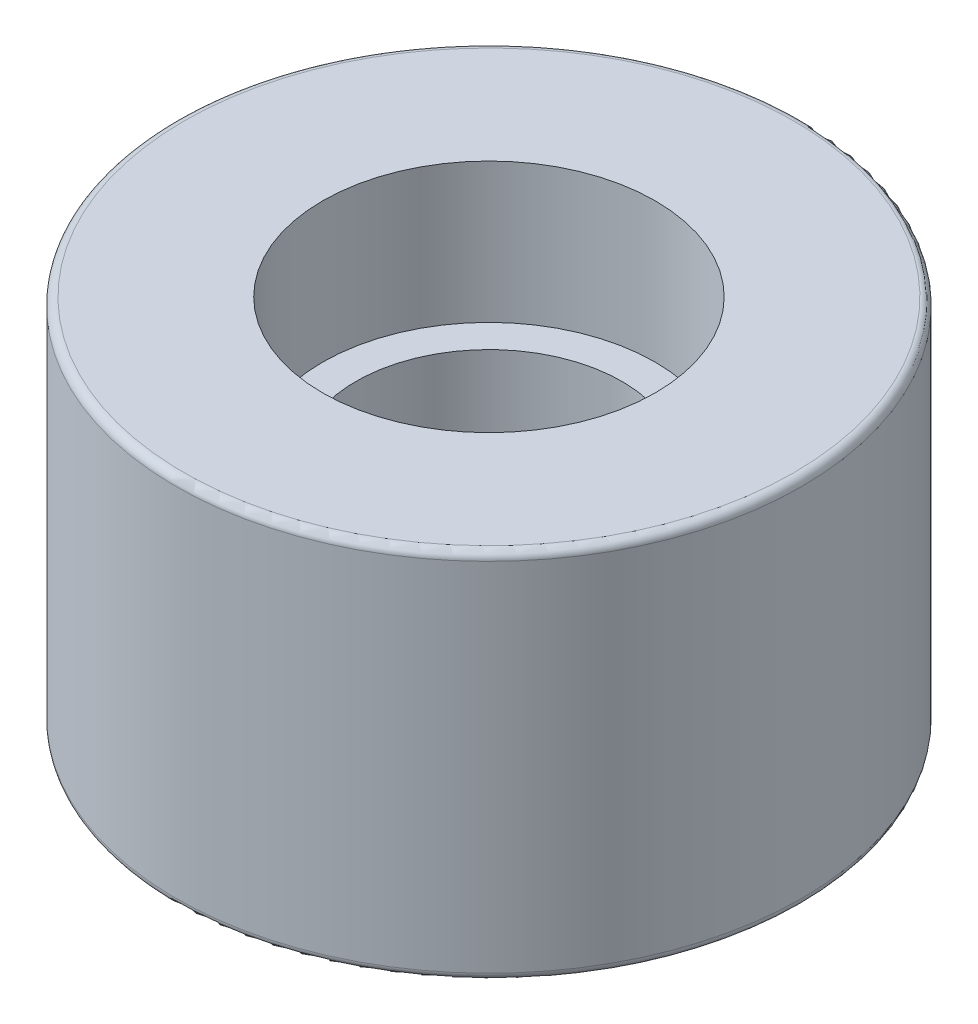
ISO-10303-21;
HEADER;
FILE_DESCRIPTION(('STEP AP214'),'2;1');
FILE_NAME('part.step','',(''),(''),'','','');
FILE_SCHEMA(('AUTOMOTIVE_DESIGN { 1 0 10303 214 1 1 1 1 }'));
ENDSEC;
DATA;
#1=APPLICATION_CONTEXT('core data for automotive mechanical design processes');
#2=APPLICATION_PROTOCOL_DEFINITION('international standard','automotive_design',2000,#1);
#3=PRODUCT_CONTEXT('',#1,'mechanical');
#4=PRODUCT('Part','Part','',(#3));
#5=PRODUCT_RELATED_PRODUCT_CATEGORY('part','',(#4));
#6=PRODUCT_DEFINITION_FORMATION('','',#4);
#7=PRODUCT_DEFINITION_CONTEXT('part definition',#1,'design');
#8=PRODUCT_DEFINITION('design','',#6,#7);
#9=PRODUCT_DEFINITION_SHAPE('','',#8);
#10=(LENGTH_UNIT() NAMED_UNIT(*) SI_UNIT(.MILLI.,.METRE.));
#11=(NAMED_UNIT(*) PLANE_ANGLE_UNIT() SI_UNIT($,.RADIAN.));
#12=(NAMED_UNIT(*) SI_UNIT($,.STERADIAN.) SOLID_ANGLE_UNIT());
#13=UNCERTAINTY_MEASURE_WITH_UNIT(LENGTH_MEASURE(1.E-05),#10,'distance_accuracy_value','');
#14=(GEOMETRIC_REPRESENTATION_CONTEXT(3) GLOBAL_UNCERTAINTY_ASSIGNED_CONTEXT((#13)) GLOBAL_UNIT_ASSIGNED_CONTEXT((#10,
#11,#12)) REPRESENTATION_CONTEXT('',''));
#15=CARTESIAN_POINT('',(0.,0.,0.));
#16=DIRECTION('',(0.,0.,1.));
#17=DIRECTION('',(1.,0.,0.));
#18=AXIS2_PLACEMENT_3D('',#15,#16,#17);
#19=CARTESIAN_POINT('',(0.,0.,0.));
#20=DIRECTION('',(0.,-1.,0.));
#21=DIRECTION('',(1.,0.,0.));
#22=AXIS2_PLACEMENT_3D('',#19,#20,#21);
#23=CYLINDRICAL_SURFACE('',#22,12.5);
#24=CARTESIAN_POINT('',(0.,28.,0.));
#25=DIRECTION('',(0.,-1.,0.));
#26=DIRECTION('',(1.,0.,0.));
#27=AXIS2_PLACEMENT_3D('',#24,#25,#26);
#28=CIRCLE('',#27,12.5);
#29=CARTESIAN_POINT('',(12.5,28.,0.));
#30=VERTEX_POINT('',#29);
#31=EDGE_CURVE('E10',#30,#30,#28,.T.);
#32=ORIENTED_EDGE('',*,*,#31,.F.);
#33=EDGE_LOOP('',(#32));
#34=FACE_BOUND('',#33,.T.);
#35=CARTESIAN_POINT('',(0.,17.5,0.));
#36=DIRECTION('',(0.,-1.,0.));
#37=DIRECTION('',(1.,0.,0.));
#38=AXIS2_PLACEMENT_3D('',#35,#36,#37);
#39=CIRCLE('',#38,12.5);
#40=CARTESIAN_POINT('',(12.5,17.5,0.));
#41=VERTEX_POINT('',#40);
#42=EDGE_CURVE('E64',#41,#41,#39,.T.);
#43=ORIENTED_EDGE('',*,*,#42,.T.);
#44=EDGE_LOOP('',(#43));
#45=FACE_BOUND('',#44,.T.);
#46=ADVANCED_FACE('F30',(#34,#45),#23,.F.);
#47=CARTESIAN_POINT('',(-12.5,28.,0.));
#48=DIRECTION('',(0.,-1.,0.));
#49=DIRECTION('',(1.,0.,0.));
#50=AXIS2_PLACEMENT_3D('',#47,#48,#49);
#51=PLANE('',#50);
#52=CARTESIAN_POINT('',(0.,28.,0.));
#53=DIRECTION('',(0.,-1.,0.));
#54=DIRECTION('',(1.,0.,0.));
#55=AXIS2_PLACEMENT_3D('',#52,#53,#54);
#56=CIRCLE('',#55,22.9);
#57=CARTESIAN_POINT('',(22.9,28.,0.));
#58=VERTEX_POINT('',#57);
#59=EDGE_CURVE('E36',#58,#58,#56,.T.);
#60=ORIENTED_EDGE('',*,*,#59,.F.);
#61=EDGE_LOOP('',(#60));
#62=FACE_BOUND('',#61,.T.);
#63=ORIENTED_EDGE('',*,*,#31,.T.);
#64=EDGE_LOOP('',(#63));
#65=FACE_BOUND('',#64,.T.);
#66=ADVANCED_FACE('F113',(#62,#65),#51,.F.);
#67=CARTESIAN_POINT('',(0.,27.4,0.));
#68=DIRECTION('',(0.,-1.,0.));
#69=DIRECTION('',(1.,0.,0.));
#70=AXIS2_PLACEMENT_3D('',#67,#68,#69);
#71=TOROIDAL_SURFACE('',#70,22.9,0.6);
#72=CARTESIAN_POINT('',(0.,27.4,0.));
#73=DIRECTION('',(0.,-1.,0.));
#74=DIRECTION('',(1.,0.,0.));
#75=AXIS2_PLACEMENT_3D('',#72,#73,#74);
#76=CIRCLE('',#75,23.5);
#77=CARTESIAN_POINT('',(23.5,27.4,0.));
#78=VERTEX_POINT('',#77);
#79=EDGE_CURVE('E40',#78,#78,#76,.T.);
#80=ORIENTED_EDGE('',*,*,#79,.F.);
#81=EDGE_LOOP('',(#80));
#82=FACE_BOUND('',#81,.T.);
#83=ORIENTED_EDGE('',*,*,#59,.T.);
#84=EDGE_LOOP('',(#83));
#85=FACE_BOUND('',#84,.T.);
#86=ADVANCED_FACE('F108',(#82,#85),#71,.T.);
#87=CARTESIAN_POINT('',(0.,0.,0.));
#88=DIRECTION('',(0.,-1.,0.));
#89=DIRECTION('',(1.,0.,0.));
#90=AXIS2_PLACEMENT_3D('',#87,#88,#89);
#91=CYLINDRICAL_SURFACE('',#90,23.5);
#92=CARTESIAN_POINT('',(0.,0.600000000000001,0.));
#93=DIRECTION('',(0.,-1.,0.));
#94=DIRECTION('',(1.,0.,0.));
#95=AXIS2_PLACEMENT_3D('',#92,#93,#94);
#96=CIRCLE('',#95,23.5);
#97=CARTESIAN_POINT('',(23.5,0.600000000000001,0.));
#98=VERTEX_POINT('',#97);
#99=EDGE_CURVE('E44',#98,#98,#96,.T.);
#100=ORIENTED_EDGE('',*,*,#99,.F.);
#101=EDGE_LOOP('',(#100));
#102=FACE_BOUND('',#101,.T.);
#103=ORIENTED_EDGE('',*,*,#79,.T.);
#104=EDGE_LOOP('',(#103));
#105=FACE_BOUND('',#104,.T.);
#106=ADVANCED_FACE('F102',(#102,#105),#91,.T.);
#107=CARTESIAN_POINT('',(0.,0.599999999999997,0.));
#108=DIRECTION('',(0.,-1.,0.));
#109=DIRECTION('',(1.,0.,0.));
#110=AXIS2_PLACEMENT_3D('',#107,#108,#109);
#111=TOROIDAL_SURFACE('',#110,22.9,0.6);
#112=CARTESIAN_POINT('',(0.,0.,0.));
#113=DIRECTION('',(0.,-1.,0.));
#114=DIRECTION('',(1.,0.,0.));
#115=AXIS2_PLACEMENT_3D('',#112,#113,#114);
#116=CIRCLE('',#115,22.9);
#117=CARTESIAN_POINT('',(22.9,0.,0.));
#118=VERTEX_POINT('',#117);
#119=EDGE_CURVE('E49',#118,#118,#116,.T.);
#120=ORIENTED_EDGE('',*,*,#119,.F.);
#121=EDGE_LOOP('',(#120));
#122=FACE_BOUND('',#121,.T.);
#123=ORIENTED_EDGE('',*,*,#99,.T.);
#124=EDGE_LOOP('',(#123));
#125=FACE_BOUND('',#124,.T.);
#126=ADVANCED_FACE('F96',(#122,#125),#111,.T.);
#127=CARTESIAN_POINT('',(-22.9,0.,0.));
#128=DIRECTION('',(0.,1.,0.));
#129=DIRECTION('',(-1.,0.,0.));
#130=AXIS2_PLACEMENT_3D('',#127,#128,#129);
#131=PLANE('',#130);
#132=CARTESIAN_POINT('',(0.,0.,0.));
#133=DIRECTION('',(0.,-1.,0.));
#134=DIRECTION('',(1.,0.,0.));
#135=AXIS2_PLACEMENT_3D('',#132,#133,#134);
#136=CIRCLE('',#135,13.5);
#137=CARTESIAN_POINT('',(13.5,0.,0.));
#138=VERTEX_POINT('',#137);
#139=EDGE_CURVE('E52',#138,#138,#136,.T.);
#140=ORIENTED_EDGE('',*,*,#139,.F.);
#141=EDGE_LOOP('',(#140));
#142=FACE_BOUND('',#141,.T.);
#143=ORIENTED_EDGE('',*,*,#119,.T.);
#144=EDGE_LOOP('',(#143));
#145=FACE_BOUND('',#144,.T.);
#146=ADVANCED_FACE('F90',(#142,#145),#131,.F.);
#147=CARTESIAN_POINT('',(0.,0.,0.));
#148=DIRECTION('',(0.,-1.,0.));
#149=DIRECTION('',(1.,0.,0.));
#150=AXIS2_PLACEMENT_3D('',#147,#148,#149);
#151=CYLINDRICAL_SURFACE('',#150,13.5);
#152=CARTESIAN_POINT('',(0.,10.5,0.));
#153=DIRECTION('',(0.,-1.,0.));
#154=DIRECTION('',(1.,0.,0.));
#155=AXIS2_PLACEMENT_3D('',#152,#153,#154);
#156=CIRCLE('',#155,13.5);
#157=CARTESIAN_POINT('',(13.5,10.5,0.));
#158=VERTEX_POINT('',#157);
#159=EDGE_CURVE('E55',#158,#158,#156,.T.);
#160=ORIENTED_EDGE('',*,*,#159,.F.);
#161=EDGE_LOOP('',(#160));
#162=FACE_BOUND('',#161,.T.);
#163=ORIENTED_EDGE('',*,*,#139,.T.);
#164=EDGE_LOOP('',(#163));
#165=FACE_BOUND('',#164,.T.);
#166=ADVANCED_FACE('F84',(#162,#165),#151,.F.);
#167=CARTESIAN_POINT('',(-10.,10.5,0.));
#168=DIRECTION('',(0.,1.,0.));
#169=DIRECTION('',(-1.,0.,0.));
#170=AXIS2_PLACEMENT_3D('',#167,#168,#169);
#171=PLANE('',#170);
#172=CARTESIAN_POINT('',(0.,10.5,0.));
#173=DIRECTION('',(0.,-1.,0.));
#174=DIRECTION('',(1.,0.,0.));
#175=AXIS2_PLACEMENT_3D('',#172,#173,#174);
#176=CIRCLE('',#175,10.);
#177=CARTESIAN_POINT('',(10.,10.5,0.));
#178=VERTEX_POINT('',#177);
#179=EDGE_CURVE('E58',#178,#178,#176,.T.);
#180=ORIENTED_EDGE('',*,*,#179,.F.);
#181=EDGE_LOOP('',(#180));
#182=FACE_BOUND('',#181,.T.);
#183=ORIENTED_EDGE('',*,*,#159,.T.);
#184=EDGE_LOOP('',(#183));
#185=FACE_BOUND('',#184,.T.);
#186=ADVANCED_FACE('F78',(#182,#185),#171,.F.);
#187=CARTESIAN_POINT('',(0.,0.,0.));
#188=DIRECTION('',(0.,-1.,0.));
#189=DIRECTION('',(1.,0.,0.));
#190=AXIS2_PLACEMENT_3D('',#187,#188,#189);
#191=CYLINDRICAL_SURFACE('',#190,10.);
#192=CARTESIAN_POINT('',(0.,17.5,0.));
#193=DIRECTION('',(0.,-1.,0.));
#194=DIRECTION('',(1.,0.,0.));
#195=AXIS2_PLACEMENT_3D('',#192,#193,#194);
#196=CIRCLE('',#195,10.);
#197=CARTESIAN_POINT('',(10.,17.5,0.));
#198=VERTEX_POINT('',#197);
#199=EDGE_CURVE('E61',#198,#198,#196,.T.);
#200=ORIENTED_EDGE('',*,*,#199,.F.);
#201=EDGE_LOOP('',(#200));
#202=FACE_BOUND('',#201,.T.);
#203=ORIENTED_EDGE('',*,*,#179,.T.);
#204=EDGE_LOOP('',(#203));
#205=FACE_BOUND('',#204,.T.);
#206=ADVANCED_FACE('F72',(#202,#205),#191,.F.);
#207=CARTESIAN_POINT('',(-12.5,17.5,0.));
#208=DIRECTION('',(0.,-1.,0.));
#209=DIRECTION('',(1.,0.,0.));
#210=AXIS2_PLACEMENT_3D('',#207,#208,#209);
#211=PLANE('',#210);
#212=ORIENTED_EDGE('',*,*,#42,.F.);
#213=EDGE_LOOP('',(#212));
#214=FACE_BOUND('',#213,.T.);
#215=ORIENTED_EDGE('',*,*,#199,.T.);
#216=EDGE_LOOP('',(#215));
#217=FACE_BOUND('',#216,.T.);
#218=ADVANCED_FACE('F69',(#214,#217),#211,.F.);
#219=CLOSED_SHELL('',(#46,#66,#86,#106,#126,#146,#166,#186,#206,#218));
#220=MANIFOLD_SOLID_BREP('B2',#219);
#221=ADVANCED_BREP_SHAPE_REPRESENTATION('',(#18,#220),#14);
#222=SHAPE_DEFINITION_REPRESENTATION(#9,#221);
ENDSEC;
END-ISO-10303-21;
